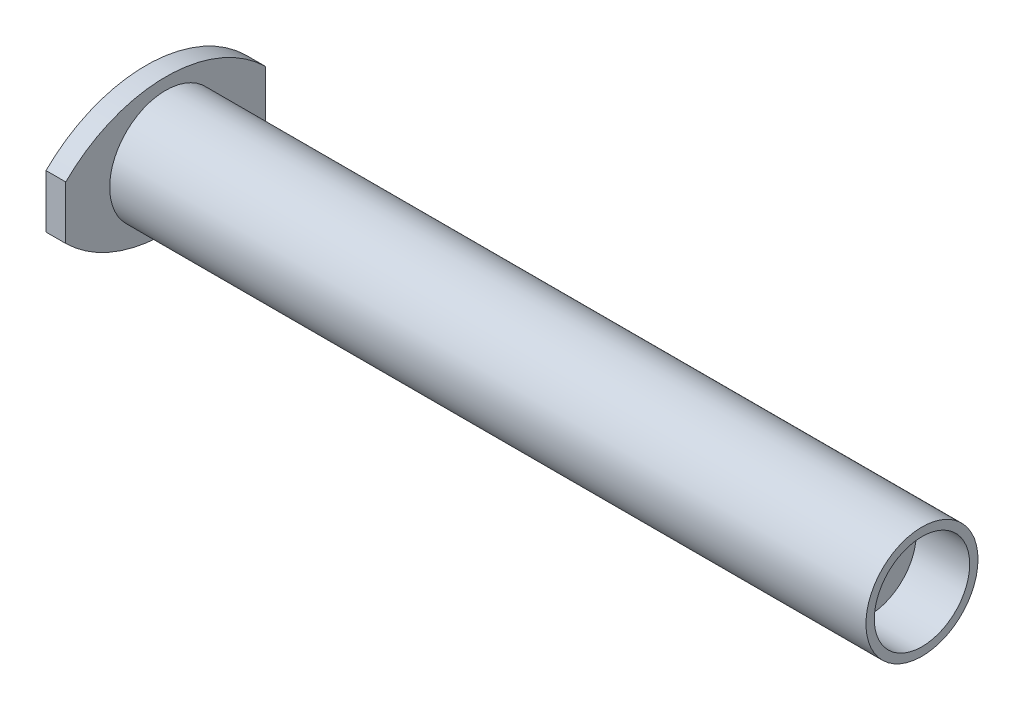
ISO-10303-21;
HEADER;
FILE_DESCRIPTION(('STEP AP214'),'2;1');
FILE_NAME('part.step','',(''),(''),'','','');
FILE_SCHEMA(('AUTOMOTIVE_DESIGN { 1 0 10303 214 1 1 1 1 }'));
ENDSEC;
DATA;
#1=APPLICATION_CONTEXT('core data for automotive mechanical design processes');
#2=APPLICATION_PROTOCOL_DEFINITION('international standard','automotive_design',2000,#1);
#3=PRODUCT_CONTEXT('',#1,'mechanical');
#4=PRODUCT('Part','Part','',(#3));
#5=PRODUCT_RELATED_PRODUCT_CATEGORY('part','',(#4));
#6=PRODUCT_DEFINITION_FORMATION('','',#4);
#7=PRODUCT_DEFINITION_CONTEXT('part definition',#1,'design');
#8=PRODUCT_DEFINITION('design','',#6,#7);
#9=PRODUCT_DEFINITION_SHAPE('','',#8);
#10=(LENGTH_UNIT() NAMED_UNIT(*) SI_UNIT(.MILLI.,.METRE.));
#11=(NAMED_UNIT(*) PLANE_ANGLE_UNIT() SI_UNIT($,.RADIAN.));
#12=(NAMED_UNIT(*) SI_UNIT($,.STERADIAN.) SOLID_ANGLE_UNIT());
#13=UNCERTAINTY_MEASURE_WITH_UNIT(LENGTH_MEASURE(1.E-05),#10,'distance_accuracy_value','');
#14=(GEOMETRIC_REPRESENTATION_CONTEXT(3) GLOBAL_UNCERTAINTY_ASSIGNED_CONTEXT((#13)) GLOBAL_UNIT_ASSIGNED_CONTEXT((#10,
#11,#12)) REPRESENTATION_CONTEXT('',''));
#15=CARTESIAN_POINT('',(0.,0.,0.));
#16=DIRECTION('',(0.,0.,1.));
#17=DIRECTION('',(1.,0.,0.));
#18=AXIS2_PLACEMENT_3D('',#15,#16,#17);
#19=CARTESIAN_POINT('',(-78.6,0.,0.));
#20=DIRECTION('',(1.,0.,0.));
#21=DIRECTION('',(0.,0.,-1.));
#22=AXIS2_PLACEMENT_3D('',#19,#20,#21);
#23=CYLINDRICAL_SURFACE('',#22,4.83);
#24=CARTESIAN_POINT('',(-59.,0.,0.));
#25=DIRECTION('',(-1.,0.,0.));
#26=DIRECTION('',(0.,0.,1.));
#27=AXIS2_PLACEMENT_3D('',#24,#25,#26);
#28=CIRCLE('',#27,4.83);
#29=CARTESIAN_POINT('',(-59.,0.,4.83));
#30=VERTEX_POINT('',#29);
#31=EDGE_CURVE('E44',#30,#30,#28,.F.);
#32=ORIENTED_EDGE('',*,*,#31,.F.);
#33=EDGE_LOOP('',(#32));
#34=FACE_BOUND('',#33,.T.);
#35=CARTESIAN_POINT('',(-6.4,0.,0.));
#36=DIRECTION('',(1.,0.,0.));
#37=DIRECTION('',(0.,0.,-1.));
#38=AXIS2_PLACEMENT_3D('',#35,#36,#37);
#39=CIRCLE('',#38,4.83);
#40=CARTESIAN_POINT('',(-6.4,0.,-4.83));
#41=VERTEX_POINT('',#40);
#42=EDGE_CURVE('E11',#41,#41,#39,.F.);
#43=ORIENTED_EDGE('',*,*,#42,.F.);
#44=EDGE_LOOP('',(#43));
#45=FACE_BOUND('',#44,.T.);
#46=ADVANCED_FACE('F35',(#34,#45),#23,.F.);
#47=CARTESIAN_POINT('',(-5.4,0.,0.));
#48=DIRECTION('',(1.,0.,0.));
#49=DIRECTION('',(0.,0.,-1.));
#50=AXIS2_PLACEMENT_3D('',#47,#48,#49);
#51=CIRCLE('',#50,4.83);
#52=CARTESIAN_POINT('',(-5.4,0.,-4.83));
#53=VERTEX_POINT('',#52);
#54=EDGE_CURVE('E199',#53,#53,#51,.T.);
#55=ORIENTED_EDGE('',*,*,#54,.F.);
#56=EDGE_LOOP('',(#55));
#57=FACE_BOUND('',#56,.T.);
#58=CARTESIAN_POINT('',(0.,0.,0.));
#59=DIRECTION('',(1.,0.,0.));
#60=DIRECTION('',(0.,0.,-1.));
#61=AXIS2_PLACEMENT_3D('',#58,#59,#60);
#62=CIRCLE('',#61,4.83);
#63=CARTESIAN_POINT('',(0.,0.,-4.83));
#64=VERTEX_POINT('',#63);
#65=EDGE_CURVE('E184',#64,#64,#62,.T.);
#66=ORIENTED_EDGE('',*,*,#65,.T.);
#67=EDGE_LOOP('',(#66));
#68=FACE_BOUND('',#67,.T.);
#69=ADVANCED_FACE('F125',(#57,#68),#23,.F.);
#70=CARTESIAN_POINT('',(-76.6,0.,0.));
#71=DIRECTION('',(1.,0.,0.));
#72=DIRECTION('',(0.,0.,-1.));
#73=AXIS2_PLACEMENT_3D('',#70,#71,#72);
#74=CYLINDRICAL_SURFACE('',#73,5.675);
#75=CARTESIAN_POINT('',(-76.6,0.,0.));
#76=DIRECTION('',(1.,0.,0.));
#77=DIRECTION('',(0.,0.,-1.));
#78=AXIS2_PLACEMENT_3D('',#75,#76,#77);
#79=CIRCLE('',#78,5.675);
#80=CARTESIAN_POINT('',(-76.6,0.,-5.675));
#81=VERTEX_POINT('',#80);
#82=EDGE_CURVE('E113',#81,#81,#79,.T.);
#83=ORIENTED_EDGE('',*,*,#82,.T.);
#84=EDGE_LOOP('',(#83));
#85=FACE_BOUND('',#84,.T.);
#86=CARTESIAN_POINT('',(0.,0.,0.));
#87=DIRECTION('',(1.,0.,0.));
#88=DIRECTION('',(0.,0.,-1.));
#89=AXIS2_PLACEMENT_3D('',#86,#87,#88);
#90=CIRCLE('',#89,5.675);
#91=CARTESIAN_POINT('',(0.,0.,-5.675));
#92=VERTEX_POINT('',#91);
#93=EDGE_CURVE('E116',#92,#92,#90,.T.);
#94=ORIENTED_EDGE('',*,*,#93,.F.);
#95=EDGE_LOOP('',(#94));
#96=FACE_BOUND('',#95,.T.);
#97=ADVANCED_FACE('F37',(#85,#96),#74,.T.);
#98=CARTESIAN_POINT('',(0.,0.,0.));
#99=DIRECTION('',(1.,0.,0.));
#100=DIRECTION('',(0.,0.,-1.));
#101=AXIS2_PLACEMENT_3D('',#98,#99,#100);
#102=PLANE('',#101);
#103=ORIENTED_EDGE('',*,*,#65,.F.);
#104=EDGE_LOOP('',(#103));
#105=FACE_BOUND('',#104,.T.);
#106=ORIENTED_EDGE('',*,*,#93,.T.);
#107=EDGE_LOOP('',(#106));
#108=FACE_BOUND('',#107,.T.);
#109=ADVANCED_FACE('F173',(#105,#108),#102,.T.);
#110=CARTESIAN_POINT('',(-78.6,-7.53935422768448,0.));
#111=DIRECTION('',(1.,0.,0.));
#112=DIRECTION('',(0.,0.,-1.));
#113=AXIS2_PLACEMENT_3D('',#110,#111,#112);
#114=CYLINDRICAL_SURFACE('',#113,14.4);
#115=CARTESIAN_POINT('',(-76.6,-7.53935422768448,0.));
#116=DIRECTION('',(-1.,0.,0.));
#117=DIRECTION('',(0.,0.,-1.));
#118=AXIS2_PLACEMENT_3D('',#115,#116,#117);
#119=CIRCLE('',#118,14.4);
#120=CARTESIAN_POINT('',(-76.6,2.7,10.125));
#121=VERTEX_POINT('',#120);
#122=CARTESIAN_POINT('',(-76.6,2.7,-10.125));
#123=VERTEX_POINT('',#122);
#124=EDGE_CURVE('E103',#121,#123,#119,.T.);
#125=ORIENTED_EDGE('',*,*,#124,.T.);
#126=DIRECTION('',(1.,0.,0.));
#127=VECTOR('',#126,1.);
#128=CARTESIAN_POINT('',(-78.6,2.7,-10.125));
#129=LINE('',#128,#127);
#130=CARTESIAN_POINT('',(-78.6,2.7,-10.125));
#131=VERTEX_POINT('',#130);
#132=EDGE_CURVE('E94',#131,#123,#129,.T.);
#133=ORIENTED_EDGE('',*,*,#132,.F.);
#134=CARTESIAN_POINT('',(-78.6,-7.53935422768448,0.));
#135=DIRECTION('',(-1.,0.,0.));
#136=DIRECTION('',(0.,0.,-1.));
#137=AXIS2_PLACEMENT_3D('',#134,#135,#136);
#138=CIRCLE('',#137,14.4);
#139=CARTESIAN_POINT('',(-78.6,2.7,10.125));
#140=VERTEX_POINT('',#139);
#141=EDGE_CURVE('E88',#140,#131,#138,.T.);
#142=ORIENTED_EDGE('',*,*,#141,.F.);
#143=DIRECTION('',(1.,0.,0.));
#144=VECTOR('',#143,1.);
#145=CARTESIAN_POINT('',(-78.6,2.7,10.125));
#146=LINE('',#145,#144);
#147=EDGE_CURVE('E99',#140,#121,#146,.T.);
#148=ORIENTED_EDGE('',*,*,#147,.T.);
#149=EDGE_LOOP('',(#125,#133,#142,#148));
#150=FACE_BOUND('',#149,.T.);
#151=ADVANCED_FACE('F171',(#150),#114,.T.);
#152=CARTESIAN_POINT('',(-78.6,-2.7,-10.125));
#153=DIRECTION('',(0.,0.,1.));
#154=DIRECTION('',(1.,0.,0.));
#155=AXIS2_PLACEMENT_3D('',#152,#153,#154);
#156=PLANE('',#155);
#157=DIRECTION('',(0.,-1.,0.));
#158=VECTOR('',#157,1.);
#159=CARTESIAN_POINT('',(-76.6,-2.7,-10.125));
#160=LINE('',#159,#158);
#161=CARTESIAN_POINT('',(-76.6,-2.7,-10.125));
#162=VERTEX_POINT('',#161);
#163=EDGE_CURVE('E93',#123,#162,#160,.T.);
#164=ORIENTED_EDGE('',*,*,#163,.T.);
#165=DIRECTION('',(1.,0.,0.));
#166=VECTOR('',#165,1.);
#167=CARTESIAN_POINT('',(-78.6,-2.7,-10.125));
#168=LINE('',#167,#166);
#169=CARTESIAN_POINT('',(-78.6,-2.7,-10.125));
#170=VERTEX_POINT('',#169);
#171=EDGE_CURVE('E91',#170,#162,#168,.T.);
#172=ORIENTED_EDGE('',*,*,#171,.F.);
#173=DIRECTION('',(0.,-1.,0.));
#174=VECTOR('',#173,1.);
#175=CARTESIAN_POINT('',(-78.6,-2.7,-10.125));
#176=LINE('',#175,#174);
#177=EDGE_CURVE('E83',#131,#170,#176,.T.);
#178=ORIENTED_EDGE('',*,*,#177,.F.);
#179=ORIENTED_EDGE('',*,*,#132,.T.);
#180=EDGE_LOOP('',(#164,#172,#178,#179));
#181=FACE_BOUND('',#180,.T.);
#182=ADVANCED_FACE('F92',(#181),#156,.F.);
#183=CARTESIAN_POINT('',(-78.6,7.53935422768448,0.));
#184=DIRECTION('',(1.,0.,0.));
#185=DIRECTION('',(0.,0.,-1.));
#186=AXIS2_PLACEMENT_3D('',#183,#184,#185);
#187=CYLINDRICAL_SURFACE('',#186,14.4);
#188=CARTESIAN_POINT('',(-76.6,7.53935422768448,0.));
#189=DIRECTION('',(-1.,0.,0.));
#190=DIRECTION('',(0.,0.,1.));
#191=AXIS2_PLACEMENT_3D('',#188,#189,#190);
#192=CIRCLE('',#191,14.4);
#193=CARTESIAN_POINT('',(-76.6,-2.7,10.125));
#194=VERTEX_POINT('',#193);
#195=EDGE_CURVE('E69',#162,#194,#192,.T.);
#196=ORIENTED_EDGE('',*,*,#195,.T.);
#197=DIRECTION('',(1.,0.,0.));
#198=VECTOR('',#197,1.);
#199=CARTESIAN_POINT('',(-78.6,-2.7,10.125));
#200=LINE('',#199,#198);
#201=CARTESIAN_POINT('',(-78.6,-2.7,10.125));
#202=VERTEX_POINT('',#201);
#203=EDGE_CURVE('E95',#202,#194,#200,.T.);
#204=ORIENTED_EDGE('',*,*,#203,.F.);
#205=CARTESIAN_POINT('',(-78.6,7.53935422768448,0.));
#206=DIRECTION('',(-1.,0.,0.));
#207=DIRECTION('',(0.,0.,1.));
#208=AXIS2_PLACEMENT_3D('',#205,#206,#207);
#209=CIRCLE('',#208,14.4);
#210=EDGE_CURVE('E86',#170,#202,#209,.T.);
#211=ORIENTED_EDGE('',*,*,#210,.F.);
#212=ORIENTED_EDGE('',*,*,#171,.T.);
#213=EDGE_LOOP('',(#196,#204,#211,#212));
#214=FACE_BOUND('',#213,.T.);
#215=ADVANCED_FACE('F97',(#214),#187,.T.);
#216=CARTESIAN_POINT('',(-78.6,-2.7,10.125));
#217=DIRECTION('',(0.,0.,-1.));
#218=DIRECTION('',(-1.,0.,0.));
#219=AXIS2_PLACEMENT_3D('',#216,#217,#218);
#220=PLANE('',#219);
#221=DIRECTION('',(0.,1.,0.));
#222=VECTOR('',#221,1.);
#223=CARTESIAN_POINT('',(-76.6,-2.7,10.125));
#224=LINE('',#223,#222);
#225=EDGE_CURVE('E75',#194,#121,#224,.T.);
#226=ORIENTED_EDGE('',*,*,#225,.T.);
#227=ORIENTED_EDGE('',*,*,#147,.F.);
#228=DIRECTION('',(0.,1.,0.));
#229=VECTOR('',#228,1.);
#230=CARTESIAN_POINT('',(-78.6,-2.7,10.125));
#231=LINE('',#230,#229);
#232=EDGE_CURVE('E52',#202,#140,#231,.T.);
#233=ORIENTED_EDGE('',*,*,#232,.F.);
#234=ORIENTED_EDGE('',*,*,#203,.T.);
#235=EDGE_LOOP('',(#226,#227,#233,#234));
#236=FACE_BOUND('',#235,.T.);
#237=ADVANCED_FACE('F160',(#236),#220,.F.);
#238=CARTESIAN_POINT('',(-78.6,-7.53935422768448,0.));
#239=DIRECTION('',(1.,0.,0.));
#240=DIRECTION('',(0.,0.,-1.));
#241=AXIS2_PLACEMENT_3D('',#238,#239,#240);
#242=PLANE('',#241);
#243=CARTESIAN_POINT('',(-78.6,0.,0.));
#244=DIRECTION('',(1.,0.,0.));
#245=DIRECTION('',(0.,0.,-1.));
#246=AXIS2_PLACEMENT_3D('',#243,#244,#245);
#247=CIRCLE('',#246,4.83);
#248=CARTESIAN_POINT('',(-78.6,0.,-4.83));
#249=VERTEX_POINT('',#248);
#250=EDGE_CURVE('E106',#249,#249,#247,.T.);
#251=ORIENTED_EDGE('',*,*,#250,.T.);
#252=EDGE_LOOP('',(#251));
#253=FACE_BOUND('',#252,.T.);
#254=ORIENTED_EDGE('',*,*,#141,.T.);
#255=ORIENTED_EDGE('',*,*,#177,.T.);
#256=ORIENTED_EDGE('',*,*,#210,.T.);
#257=ORIENTED_EDGE('',*,*,#232,.T.);
#258=EDGE_LOOP('',(#254,#255,#256,#257));
#259=FACE_BOUND('',#258,.T.);
#260=ADVANCED_FACE('F84',(#253,#259),#242,.F.);
#261=CARTESIAN_POINT('',(-76.6,-7.53935422768448,0.));
#262=DIRECTION('',(1.,0.,0.));
#263=DIRECTION('',(0.,0.,-1.));
#264=AXIS2_PLACEMENT_3D('',#261,#262,#263);
#265=PLANE('',#264);
#266=ORIENTED_EDGE('',*,*,#82,.F.);
#267=EDGE_LOOP('',(#266));
#268=FACE_BOUND('',#267,.T.);
#269=ORIENTED_EDGE('',*,*,#124,.F.);
#270=ORIENTED_EDGE('',*,*,#225,.F.);
#271=ORIENTED_EDGE('',*,*,#195,.F.);
#272=ORIENTED_EDGE('',*,*,#163,.F.);
#273=EDGE_LOOP('',(#269,#270,#271,#272));
#274=FACE_BOUND('',#273,.T.);
#275=ADVANCED_FACE('F156',(#268,#274),#265,.T.);
#276=CARTESIAN_POINT('',(-60.,0.,0.));
#277=DIRECTION('',(-1.,0.,0.));
#278=DIRECTION('',(0.,0.,1.));
#279=AXIS2_PLACEMENT_3D('',#276,#277,#278);
#280=CIRCLE('',#279,4.83);
#281=CARTESIAN_POINT('',(-60.,0.,4.83));
#282=VERTEX_POINT('',#281);
#283=EDGE_CURVE('E188',#282,#282,#280,.T.);
#284=ORIENTED_EDGE('',*,*,#283,.F.);
#285=EDGE_LOOP('',(#284));
#286=FACE_BOUND('',#285,.T.);
#287=ORIENTED_EDGE('',*,*,#250,.F.);
#288=EDGE_LOOP('',(#287));
#289=FACE_BOUND('',#288,.T.);
#290=ADVANCED_FACE('F127',(#286,#289),#23,.F.);
#291=CARTESIAN_POINT('',(-59.,0.,0.));
#292=DIRECTION('',(-1.,0.,0.));
#293=DIRECTION('',(0.,0.,1.));
#294=AXIS2_PLACEMENT_3D('',#291,#292,#293);
#295=PLANE('',#294);
#296=CARTESIAN_POINT('',(-59.,0.,0.));
#297=DIRECTION('',(-1.,0.,0.));
#298=DIRECTION('',(0.,0.,1.));
#299=AXIS2_PLACEMENT_3D('',#296,#297,#298);
#300=CIRCLE('',#299,1.71);
#301=CARTESIAN_POINT('',(-59.,0.,1.71));
#302=VERTEX_POINT('',#301);
#303=EDGE_CURVE('E193',#302,#302,#300,.T.);
#304=ORIENTED_EDGE('',*,*,#303,.T.);
#305=EDGE_LOOP('',(#304));
#306=FACE_BOUND('',#305,.T.);
#307=ORIENTED_EDGE('',*,*,#31,.T.);
#308=EDGE_LOOP('',(#307));
#309=FACE_BOUND('',#308,.T.);
#310=ADVANCED_FACE('F121',(#306,#309),#295,.F.);
#311=CARTESIAN_POINT('',(-60.,0.,0.));
#312=DIRECTION('',(-1.,0.,0.));
#313=DIRECTION('',(0.,0.,1.));
#314=AXIS2_PLACEMENT_3D('',#311,#312,#313);
#315=PLANE('',#314);
#316=CARTESIAN_POINT('',(-60.,0.,0.));
#317=DIRECTION('',(-1.,0.,0.));
#318=DIRECTION('',(0.,0.,1.));
#319=AXIS2_PLACEMENT_3D('',#316,#317,#318);
#320=CIRCLE('',#319,1.71);
#321=CARTESIAN_POINT('',(-60.,0.,1.71));
#322=VERTEX_POINT('',#321);
#323=EDGE_CURVE('E196',#322,#322,#320,.T.);
#324=ORIENTED_EDGE('',*,*,#323,.F.);
#325=EDGE_LOOP('',(#324));
#326=FACE_BOUND('',#325,.T.);
#327=ORIENTED_EDGE('',*,*,#283,.T.);
#328=EDGE_LOOP('',(#327));
#329=FACE_BOUND('',#328,.T.);
#330=ADVANCED_FACE('F143',(#326,#329),#315,.T.);
#331=CARTESIAN_POINT('',(-59.,0.,0.));
#332=DIRECTION('',(-1.,0.,0.));
#333=DIRECTION('',(0.,0.,1.));
#334=AXIS2_PLACEMENT_3D('',#331,#332,#333);
#335=CYLINDRICAL_SURFACE('',#334,1.71);
#336=ORIENTED_EDGE('',*,*,#303,.F.);
#337=EDGE_LOOP('',(#336));
#338=FACE_BOUND('',#337,.T.);
#339=ORIENTED_EDGE('',*,*,#323,.T.);
#340=EDGE_LOOP('',(#339));
#341=FACE_BOUND('',#340,.T.);
#342=ADVANCED_FACE('F133',(#338,#341),#335,.F.);
#343=CARTESIAN_POINT('',(-6.4,0.,0.));
#344=DIRECTION('',(1.,0.,0.));
#345=DIRECTION('',(0.,0.,-1.));
#346=AXIS2_PLACEMENT_3D('',#343,#344,#345);
#347=PLANE('',#346);
#348=CARTESIAN_POINT('',(-6.4,0.,0.));
#349=DIRECTION('',(1.,0.,0.));
#350=DIRECTION('',(0.,0.,-1.));
#351=AXIS2_PLACEMENT_3D('',#348,#349,#350);
#352=CIRCLE('',#351,2.4);
#353=CARTESIAN_POINT('',(-6.4,0.,-2.4));
#354=VERTEX_POINT('',#353);
#355=EDGE_CURVE('E204',#354,#354,#352,.T.);
#356=ORIENTED_EDGE('',*,*,#355,.T.);
#357=EDGE_LOOP('',(#356));
#358=FACE_BOUND('',#357,.T.);
#359=ORIENTED_EDGE('',*,*,#42,.T.);
#360=EDGE_LOOP('',(#359));
#361=FACE_BOUND('',#360,.T.);
#362=ADVANCED_FACE('F130',(#358,#361),#347,.F.);
#363=CARTESIAN_POINT('',(-5.4,0.,0.));
#364=DIRECTION('',(1.,0.,0.));
#365=DIRECTION('',(0.,0.,-1.));
#366=AXIS2_PLACEMENT_3D('',#363,#364,#365);
#367=PLANE('',#366);
#368=CARTESIAN_POINT('',(-5.4,0.,0.));
#369=DIRECTION('',(1.,0.,0.));
#370=DIRECTION('',(0.,0.,-1.));
#371=AXIS2_PLACEMENT_3D('',#368,#369,#370);
#372=CIRCLE('',#371,2.4);
#373=CARTESIAN_POINT('',(-5.4,0.,-2.4));
#374=VERTEX_POINT('',#373);
#375=EDGE_CURVE('E205',#374,#374,#372,.T.);
#376=ORIENTED_EDGE('',*,*,#375,.F.);
#377=EDGE_LOOP('',(#376));
#378=FACE_BOUND('',#377,.T.);
#379=ORIENTED_EDGE('',*,*,#54,.T.);
#380=EDGE_LOOP('',(#379));
#381=FACE_BOUND('',#380,.T.);
#382=ADVANCED_FACE('F132',(#378,#381),#367,.T.);
#383=CARTESIAN_POINT('',(-6.4,0.,0.));
#384=DIRECTION('',(1.,0.,0.));
#385=DIRECTION('',(0.,0.,-1.));
#386=AXIS2_PLACEMENT_3D('',#383,#384,#385);
#387=CYLINDRICAL_SURFACE('',#386,2.4);
#388=ORIENTED_EDGE('',*,*,#355,.F.);
#389=EDGE_LOOP('',(#388));
#390=FACE_BOUND('',#389,.T.);
#391=ORIENTED_EDGE('',*,*,#375,.T.);
#392=EDGE_LOOP('',(#391));
#393=FACE_BOUND('',#392,.T.);
#394=ADVANCED_FACE('F140',(#390,#393),#387,.F.);
#395=CLOSED_SHELL('',(#46,#69,#97,#109,#151,#182,#215,#237,#260,#275,#290,#310,#330,#342,#362,
#382,#394));
#396=MANIFOLD_SOLID_BREP('B2',#395);
#397=ADVANCED_BREP_SHAPE_REPRESENTATION('',(#18,#396),#14);
#398=SHAPE_DEFINITION_REPRESENTATION(#9,#397);
ENDSEC;
END-ISO-10303-21;
